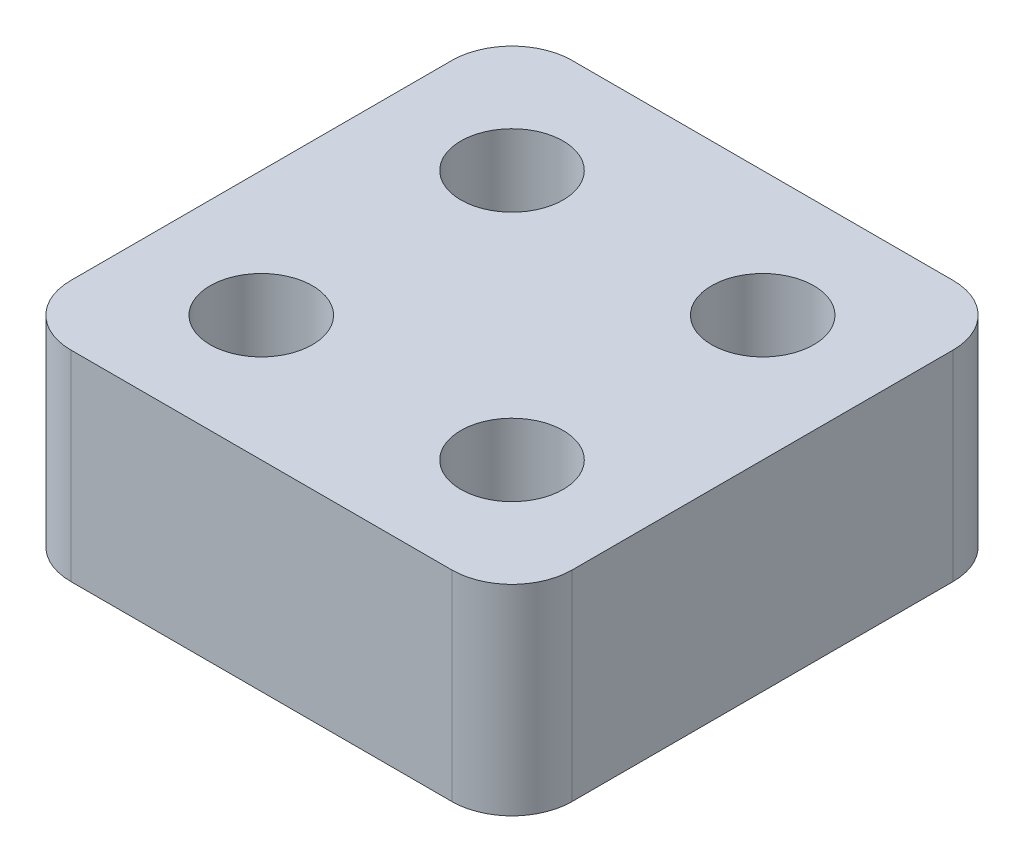
ISO-10303-21;
HEADER;
FILE_DESCRIPTION(('STEP AP214'),'2;1');
FILE_NAME('part.step','',(''),(''),'','','');
FILE_SCHEMA(('AUTOMOTIVE_DESIGN { 1 0 10303 214 1 1 1 1 }'));
ENDSEC;
DATA;
#1=APPLICATION_CONTEXT('core data for automotive mechanical design processes');
#2=APPLICATION_PROTOCOL_DEFINITION('international standard','automotive_design',2000,#1);
#3=PRODUCT_CONTEXT('',#1,'mechanical');
#4=PRODUCT('Part','Part','',(#3));
#5=PRODUCT_RELATED_PRODUCT_CATEGORY('part','',(#4));
#6=PRODUCT_DEFINITION_FORMATION('','',#4);
#7=PRODUCT_DEFINITION_CONTEXT('part definition',#1,'design');
#8=PRODUCT_DEFINITION('design','',#6,#7);
#9=PRODUCT_DEFINITION_SHAPE('','',#8);
#10=(LENGTH_UNIT() NAMED_UNIT(*) SI_UNIT(.MILLI.,.METRE.));
#11=(NAMED_UNIT(*) PLANE_ANGLE_UNIT() SI_UNIT($,.RADIAN.));
#12=(NAMED_UNIT(*) SI_UNIT($,.STERADIAN.) SOLID_ANGLE_UNIT());
#13=UNCERTAINTY_MEASURE_WITH_UNIT(LENGTH_MEASURE(1.E-05),#10,'distance_accuracy_value','');
#14=(GEOMETRIC_REPRESENTATION_CONTEXT(3) GLOBAL_UNCERTAINTY_ASSIGNED_CONTEXT((#13)) GLOBAL_UNIT_ASSIGNED_CONTEXT((#10,
#11,#12)) REPRESENTATION_CONTEXT('',''));
#15=CARTESIAN_POINT('',(0.,0.,0.));
#16=DIRECTION('',(0.,0.,1.));
#17=DIRECTION('',(1.,0.,0.));
#18=AXIS2_PLACEMENT_3D('',#15,#16,#17);
#19=CARTESIAN_POINT('',(-9.50000000000002,10.,9.49999999999997));
#20=DIRECTION('',(0.,1.,0.));
#21=DIRECTION('',(0.,0.,1.));
#22=AXIS2_PLACEMENT_3D('',#19,#20,#21);
#23=PLANE('',#22);
#24=CARTESIAN_POINT('',(-6.25000000000003,10.,6.25000000000005));
#25=DIRECTION('',(0.,1.,0.));
#26=DIRECTION('',(0.,0.,1.));
#27=AXIS2_PLACEMENT_3D('',#24,#25,#26);
#28=CIRCLE('',#27,2.55);
#29=CARTESIAN_POINT('',(-6.25000000000003,10.,8.80000000000005));
#30=VERTEX_POINT('',#29);
#31=EDGE_CURVE('E192',#30,#30,#28,.T.);
#32=ORIENTED_EDGE('',*,*,#31,.F.);
#33=EDGE_LOOP('',(#32));
#34=FACE_BOUND('',#33,.T.);
#35=CARTESIAN_POINT('',(-6.24999999999997,10.,-6.25000000000011));
#36=DIRECTION('',(0.,1.,0.));
#37=DIRECTION('',(0.,0.,1.));
#38=AXIS2_PLACEMENT_3D('',#35,#36,#37);
#39=CIRCLE('',#38,2.55);
#40=CARTESIAN_POINT('',(-6.24999999999997,10.,-3.70000000000011));
#41=VERTEX_POINT('',#40);
#42=EDGE_CURVE('E138',#41,#41,#39,.T.);
#43=ORIENTED_EDGE('',*,*,#42,.F.);
#44=EDGE_LOOP('',(#43));
#45=FACE_BOUND('',#44,.T.);
#46=CARTESIAN_POINT('',(-9.50000000000002,10.,9.49999999999997));
#47=DIRECTION('',(0.,1.,0.));
#48=DIRECTION('',(0.,0.,1.));
#49=AXIS2_PLACEMENT_3D('',#46,#47,#48);
#50=CIRCLE('',#49,3.);
#51=CARTESIAN_POINT('',(-12.5,10.,9.49999999999997));
#52=VERTEX_POINT('',#51);
#53=CARTESIAN_POINT('',(-9.50000000000002,10.,12.5));
#54=VERTEX_POINT('',#53);
#55=EDGE_CURVE('E149',#52,#54,#50,.T.);
#56=ORIENTED_EDGE('',*,*,#55,.T.);
#57=DIRECTION('',(1.,0.,0.));
#58=VECTOR('',#57,1.);
#59=CARTESIAN_POINT('',(-9.50000000000002,10.,12.5));
#60=LINE('',#59,#58);
#61=CARTESIAN_POINT('',(9.49999999999998,10.,12.5));
#62=VERTEX_POINT('',#61);
#63=EDGE_CURVE('E97',#54,#62,#60,.T.);
#64=ORIENTED_EDGE('',*,*,#63,.T.);
#65=CARTESIAN_POINT('',(9.49999999999998,10.,9.49999999999997));
#66=DIRECTION('',(0.,1.,0.));
#67=DIRECTION('',(0.,0.,1.));
#68=AXIS2_PLACEMENT_3D('',#65,#66,#67);
#69=CIRCLE('',#68,3.);
#70=CARTESIAN_POINT('',(12.5,10.,9.49999999999997));
#71=VERTEX_POINT('',#70);
#72=EDGE_CURVE('E164',#62,#71,#69,.T.);
#73=ORIENTED_EDGE('',*,*,#72,.T.);
#74=DIRECTION('',(0.,0.,-1.));
#75=VECTOR('',#74,1.);
#76=CARTESIAN_POINT('',(12.5,10.,-9.49999999999995));
#77=LINE('',#76,#75);
#78=CARTESIAN_POINT('',(12.5,10.,-9.49999999999995));
#79=VERTEX_POINT('',#78);
#80=EDGE_CURVE('E177',#71,#79,#77,.T.);
#81=ORIENTED_EDGE('',*,*,#80,.T.);
#82=CARTESIAN_POINT('',(9.49999999999998,10.,-9.49999999999995));
#83=DIRECTION('',(0.,1.,0.));
#84=DIRECTION('',(0.,0.,-1.));
#85=AXIS2_PLACEMENT_3D('',#82,#83,#84);
#86=CIRCLE('',#85,3.);
#87=CARTESIAN_POINT('',(9.49999999999998,10.,-12.4999999999999));
#88=VERTEX_POINT('',#87);
#89=EDGE_CURVE('E116',#79,#88,#86,.T.);
#90=ORIENTED_EDGE('',*,*,#89,.T.);
#91=DIRECTION('',(-1.,0.,0.));
#92=VECTOR('',#91,1.);
#93=CARTESIAN_POINT('',(-9.50000000000002,10.,-12.4999999999999));
#94=LINE('',#93,#92);
#95=CARTESIAN_POINT('',(-9.50000000000002,10.,-12.4999999999999));
#96=VERTEX_POINT('',#95);
#97=EDGE_CURVE('E110',#88,#96,#94,.T.);
#98=ORIENTED_EDGE('',*,*,#97,.T.);
#99=CARTESIAN_POINT('',(-9.50000000000002,10.,-9.49999999999995));
#100=DIRECTION('',(0.,1.,0.));
#101=DIRECTION('',(0.,0.,1.));
#102=AXIS2_PLACEMENT_3D('',#99,#100,#101);
#103=CIRCLE('',#102,3.);
#104=CARTESIAN_POINT('',(-12.5,10.,-9.49999999999995));
#105=VERTEX_POINT('',#104);
#106=EDGE_CURVE('E114',#96,#105,#103,.T.);
#107=ORIENTED_EDGE('',*,*,#106,.T.);
#108=DIRECTION('',(0.,0.,1.));
#109=VECTOR('',#108,1.);
#110=CARTESIAN_POINT('',(-12.5,10.,-9.49999999999995));
#111=LINE('',#110,#109);
#112=EDGE_CURVE('E54',#105,#52,#111,.T.);
#113=ORIENTED_EDGE('',*,*,#112,.T.);
#114=EDGE_LOOP('',(#56,#64,#73,#81,#90,#98,#107,#113));
#115=FACE_BOUND('',#114,.T.);
#116=CARTESIAN_POINT('',(6.25000000000004,10.,-6.25));
#117=DIRECTION('',(0.,1.,0.));
#118=DIRECTION('',(0.,0.,1.));
#119=AXIS2_PLACEMENT_3D('',#116,#117,#118);
#120=CIRCLE('',#119,2.55);
#121=CARTESIAN_POINT('',(6.25000000000004,10.,-3.69999999999999));
#122=VERTEX_POINT('',#121);
#123=EDGE_CURVE('E186',#122,#122,#120,.T.);
#124=ORIENTED_EDGE('',*,*,#123,.F.);
#125=EDGE_LOOP('',(#124));
#126=FACE_BOUND('',#125,.T.);
#127=CARTESIAN_POINT('',(6.25000000000007,10.,6.25000000000002));
#128=DIRECTION('',(0.,1.,0.));
#129=DIRECTION('',(0.,0.,1.));
#130=AXIS2_PLACEMENT_3D('',#127,#128,#129);
#131=CIRCLE('',#130,2.55);
#132=CARTESIAN_POINT('',(6.25000000000007,10.,8.80000000000002));
#133=VERTEX_POINT('',#132);
#134=EDGE_CURVE('E198',#133,#133,#131,.T.);
#135=ORIENTED_EDGE('',*,*,#134,.F.);
#136=EDGE_LOOP('',(#135));
#137=FACE_BOUND('',#136,.T.);
#138=ADVANCED_FACE('F37',(#34,#45,#115,#126,#137),#23,.T.);
#139=CARTESIAN_POINT('',(-9.50000000000002,0.,9.49999999999997));
#140=DIRECTION('',(0.,1.,0.));
#141=DIRECTION('',(0.,0.,1.));
#142=AXIS2_PLACEMENT_3D('',#139,#140,#141);
#143=PLANE('',#142);
#144=CARTESIAN_POINT('',(-9.50000000000002,0.,9.49999999999997));
#145=DIRECTION('',(0.,1.,0.));
#146=DIRECTION('',(0.,0.,1.));
#147=AXIS2_PLACEMENT_3D('',#144,#145,#146);
#148=CIRCLE('',#147,3.);
#149=CARTESIAN_POINT('',(-12.5,0.,9.49999999999997));
#150=VERTEX_POINT('',#149);
#151=CARTESIAN_POINT('',(-9.50000000000002,0.,12.5));
#152=VERTEX_POINT('',#151);
#153=EDGE_CURVE('E134',#150,#152,#148,.T.);
#154=ORIENTED_EDGE('',*,*,#153,.F.);
#155=DIRECTION('',(0.,0.,1.));
#156=VECTOR('',#155,1.);
#157=CARTESIAN_POINT('',(-12.5,0.,-9.49999999999995));
#158=LINE('',#157,#156);
#159=CARTESIAN_POINT('',(-12.5,0.,-9.49999999999995));
#160=VERTEX_POINT('',#159);
#161=EDGE_CURVE('E89',#160,#150,#158,.T.);
#162=ORIENTED_EDGE('',*,*,#161,.F.);
#163=CARTESIAN_POINT('',(-9.50000000000002,0.,-9.49999999999995));
#164=DIRECTION('',(0.,1.,0.));
#165=DIRECTION('',(0.,0.,1.));
#166=AXIS2_PLACEMENT_3D('',#163,#164,#165);
#167=CIRCLE('',#166,3.);
#168=CARTESIAN_POINT('',(-9.50000000000002,0.,-12.4999999999999));
#169=VERTEX_POINT('',#168);
#170=EDGE_CURVE('E83',#169,#160,#167,.T.);
#171=ORIENTED_EDGE('',*,*,#170,.F.);
#172=DIRECTION('',(-1.,0.,0.));
#173=VECTOR('',#172,1.);
#174=CARTESIAN_POINT('',(-9.50000000000002,0.,-12.4999999999999));
#175=LINE('',#174,#173);
#176=CARTESIAN_POINT('',(9.49999999999998,0.,-12.4999999999999));
#177=VERTEX_POINT('',#176);
#178=EDGE_CURVE('E124',#177,#169,#175,.T.);
#179=ORIENTED_EDGE('',*,*,#178,.F.);
#180=CARTESIAN_POINT('',(9.49999999999998,0.,-9.49999999999995));
#181=DIRECTION('',(0.,1.,0.));
#182=DIRECTION('',(0.,0.,-1.));
#183=AXIS2_PLACEMENT_3D('',#180,#181,#182);
#184=CIRCLE('',#183,3.);
#185=CARTESIAN_POINT('',(12.5,0.,-9.49999999999995));
#186=VERTEX_POINT('',#185);
#187=EDGE_CURVE('E144',#186,#177,#184,.T.);
#188=ORIENTED_EDGE('',*,*,#187,.F.);
#189=DIRECTION('',(0.,0.,-1.));
#190=VECTOR('',#189,1.);
#191=CARTESIAN_POINT('',(12.5,0.,-9.49999999999995));
#192=LINE('',#191,#190);
#193=CARTESIAN_POINT('',(12.5,0.,9.49999999999997));
#194=VERTEX_POINT('',#193);
#195=EDGE_CURVE('E142',#194,#186,#192,.T.);
#196=ORIENTED_EDGE('',*,*,#195,.F.);
#197=CARTESIAN_POINT('',(9.49999999999998,0.,9.49999999999997));
#198=DIRECTION('',(0.,1.,0.));
#199=DIRECTION('',(0.,0.,1.));
#200=AXIS2_PLACEMENT_3D('',#197,#198,#199);
#201=CIRCLE('',#200,3.);
#202=CARTESIAN_POINT('',(9.49999999999998,0.,12.5));
#203=VERTEX_POINT('',#202);
#204=EDGE_CURVE('E140',#203,#194,#201,.T.);
#205=ORIENTED_EDGE('',*,*,#204,.F.);
#206=DIRECTION('',(1.,0.,0.));
#207=VECTOR('',#206,1.);
#208=CARTESIAN_POINT('',(-9.50000000000002,0.,12.5));
#209=LINE('',#208,#207);
#210=EDGE_CURVE('E137',#152,#203,#209,.T.);
#211=ORIENTED_EDGE('',*,*,#210,.F.);
#212=EDGE_LOOP('',(#154,#162,#171,#179,#188,#196,#205,#211));
#213=FACE_BOUND('',#212,.T.);
#214=CARTESIAN_POINT('',(-6.24999999999997,0.,-6.25000000000011));
#215=DIRECTION('',(0.,1.,0.));
#216=DIRECTION('',(0.,0.,1.));
#217=AXIS2_PLACEMENT_3D('',#214,#215,#216);
#218=CIRCLE('',#217,2.55);
#219=CARTESIAN_POINT('',(-6.24999999999997,0.,-3.70000000000011));
#220=VERTEX_POINT('',#219);
#221=EDGE_CURVE('E183',#220,#220,#218,.T.);
#222=ORIENTED_EDGE('',*,*,#221,.T.);
#223=EDGE_LOOP('',(#222));
#224=FACE_BOUND('',#223,.T.);
#225=CARTESIAN_POINT('',(6.25000000000004,0.,-6.25));
#226=DIRECTION('',(0.,1.,0.));
#227=DIRECTION('',(0.,0.,1.));
#228=AXIS2_PLACEMENT_3D('',#225,#226,#227);
#229=CIRCLE('',#228,2.55);
#230=CARTESIAN_POINT('',(6.25000000000004,0.,-3.69999999999999));
#231=VERTEX_POINT('',#230);
#232=EDGE_CURVE('E189',#231,#231,#229,.T.);
#233=ORIENTED_EDGE('',*,*,#232,.T.);
#234=EDGE_LOOP('',(#233));
#235=FACE_BOUND('',#234,.T.);
#236=CARTESIAN_POINT('',(-6.25000000000003,0.,6.25000000000005));
#237=DIRECTION('',(0.,1.,0.));
#238=DIRECTION('',(0.,0.,1.));
#239=AXIS2_PLACEMENT_3D('',#236,#237,#238);
#240=CIRCLE('',#239,2.55);
#241=CARTESIAN_POINT('',(-6.25000000000003,0.,8.80000000000005));
#242=VERTEX_POINT('',#241);
#243=EDGE_CURVE('E195',#242,#242,#240,.T.);
#244=ORIENTED_EDGE('',*,*,#243,.T.);
#245=EDGE_LOOP('',(#244));
#246=FACE_BOUND('',#245,.T.);
#247=CARTESIAN_POINT('',(6.25000000000007,0.,6.25000000000002));
#248=DIRECTION('',(0.,1.,0.));
#249=DIRECTION('',(0.,0.,1.));
#250=AXIS2_PLACEMENT_3D('',#247,#248,#249);
#251=CIRCLE('',#250,2.55);
#252=CARTESIAN_POINT('',(6.25000000000007,0.,8.80000000000002));
#253=VERTEX_POINT('',#252);
#254=EDGE_CURVE('E201',#253,#253,#251,.T.);
#255=ORIENTED_EDGE('',*,*,#254,.T.);
#256=EDGE_LOOP('',(#255));
#257=FACE_BOUND('',#256,.T.);
#258=ADVANCED_FACE('F168',(#213,#224,#235,#246,#257),#143,.F.);
#259=CARTESIAN_POINT('',(-9.50000000000002,10.,9.49999999999997));
#260=DIRECTION('',(0.,-1.,0.));
#261=DIRECTION('',(0.,0.,-1.));
#262=AXIS2_PLACEMENT_3D('',#259,#260,#261);
#263=CYLINDRICAL_SURFACE('',#262,3.);
#264=ORIENTED_EDGE('',*,*,#153,.T.);
#265=DIRECTION('',(0.,-1.,0.));
#266=VECTOR('',#265,1.);
#267=CARTESIAN_POINT('',(-9.50000000000002,10.,12.5));
#268=LINE('',#267,#266);
#269=EDGE_CURVE('E11',#54,#152,#268,.T.);
#270=ORIENTED_EDGE('',*,*,#269,.F.);
#271=ORIENTED_EDGE('',*,*,#55,.F.);
#272=DIRECTION('',(0.,-1.,0.));
#273=VECTOR('',#272,1.);
#274=CARTESIAN_POINT('',(-12.5,10.,9.49999999999997));
#275=LINE('',#274,#273);
#276=EDGE_CURVE('E130',#52,#150,#275,.T.);
#277=ORIENTED_EDGE('',*,*,#276,.T.);
#278=EDGE_LOOP('',(#264,#270,#271,#277));
#279=FACE_BOUND('',#278,.T.);
#280=ADVANCED_FACE('F39',(#279),#263,.T.);
#281=CARTESIAN_POINT('',(-9.50000000000002,10.,12.5));
#282=DIRECTION('',(0.,0.,-1.));
#283=DIRECTION('',(-1.,0.,0.));
#284=AXIS2_PLACEMENT_3D('',#281,#282,#283);
#285=PLANE('',#284);
#286=ORIENTED_EDGE('',*,*,#210,.T.);
#287=DIRECTION('',(0.,-1.,0.));
#288=VECTOR('',#287,1.);
#289=CARTESIAN_POINT('',(9.49999999999998,10.,12.5));
#290=LINE('',#289,#288);
#291=EDGE_CURVE('E46',#62,#203,#290,.T.);
#292=ORIENTED_EDGE('',*,*,#291,.F.);
#293=ORIENTED_EDGE('',*,*,#63,.F.);
#294=ORIENTED_EDGE('',*,*,#269,.T.);
#295=EDGE_LOOP('',(#286,#292,#293,#294));
#296=FACE_BOUND('',#295,.T.);
#297=ADVANCED_FACE('F235',(#296),#285,.F.);
#298=CARTESIAN_POINT('',(9.49999999999998,10.,9.49999999999997));
#299=DIRECTION('',(0.,-1.,0.));
#300=DIRECTION('',(0.,0.,-1.));
#301=AXIS2_PLACEMENT_3D('',#298,#299,#300);
#302=CYLINDRICAL_SURFACE('',#301,3.);
#303=ORIENTED_EDGE('',*,*,#204,.T.);
#304=DIRECTION('',(0.,-1.,0.));
#305=VECTOR('',#304,1.);
#306=CARTESIAN_POINT('',(12.5,10.,9.49999999999997));
#307=LINE('',#306,#305);
#308=EDGE_CURVE('E156',#71,#194,#307,.T.);
#309=ORIENTED_EDGE('',*,*,#308,.F.);
#310=ORIENTED_EDGE('',*,*,#72,.F.);
#311=ORIENTED_EDGE('',*,*,#291,.T.);
#312=EDGE_LOOP('',(#303,#309,#310,#311));
#313=FACE_BOUND('',#312,.T.);
#314=ADVANCED_FACE('F162',(#313),#302,.T.);
#315=CARTESIAN_POINT('',(12.5,10.,-9.49999999999995));
#316=DIRECTION('',(-1.,0.,0.));
#317=DIRECTION('',(0.,0.,1.));
#318=AXIS2_PLACEMENT_3D('',#315,#316,#317);
#319=PLANE('',#318);
#320=ORIENTED_EDGE('',*,*,#195,.T.);
#321=DIRECTION('',(0.,-1.,0.));
#322=VECTOR('',#321,1.);
#323=CARTESIAN_POINT('',(12.5,10.,-9.49999999999995));
#324=LINE('',#323,#322);
#325=EDGE_CURVE('E153',#79,#186,#324,.T.);
#326=ORIENTED_EDGE('',*,*,#325,.F.);
#327=ORIENTED_EDGE('',*,*,#80,.F.);
#328=ORIENTED_EDGE('',*,*,#308,.T.);
#329=EDGE_LOOP('',(#320,#326,#327,#328));
#330=FACE_BOUND('',#329,.T.);
#331=ADVANCED_FACE('F173',(#330),#319,.F.);
#332=CARTESIAN_POINT('',(9.49999999999998,10.,-9.49999999999995));
#333=DIRECTION('',(0.,-1.,0.));
#334=DIRECTION('',(0.,0.,-1.));
#335=AXIS2_PLACEMENT_3D('',#332,#333,#334);
#336=CYLINDRICAL_SURFACE('',#335,3.);
#337=ORIENTED_EDGE('',*,*,#187,.T.);
#338=DIRECTION('',(0.,-1.,0.));
#339=VECTOR('',#338,1.);
#340=CARTESIAN_POINT('',(9.49999999999998,10.,-12.4999999999999));
#341=LINE('',#340,#339);
#342=EDGE_CURVE('E125',#88,#177,#341,.T.);
#343=ORIENTED_EDGE('',*,*,#342,.F.);
#344=ORIENTED_EDGE('',*,*,#89,.F.);
#345=ORIENTED_EDGE('',*,*,#325,.T.);
#346=EDGE_LOOP('',(#337,#343,#344,#345));
#347=FACE_BOUND('',#346,.T.);
#348=ADVANCED_FACE('F176',(#347),#336,.T.);
#349=CARTESIAN_POINT('',(-9.50000000000002,10.,-12.4999999999999));
#350=DIRECTION('',(0.,0.,1.));
#351=DIRECTION('',(1.,0.,0.));
#352=AXIS2_PLACEMENT_3D('',#349,#350,#351);
#353=PLANE('',#352);
#354=ORIENTED_EDGE('',*,*,#178,.T.);
#355=DIRECTION('',(0.,-1.,0.));
#356=VECTOR('',#355,1.);
#357=CARTESIAN_POINT('',(-9.50000000000002,10.,-12.4999999999999));
#358=LINE('',#357,#356);
#359=EDGE_CURVE('E121',#96,#169,#358,.T.);
#360=ORIENTED_EDGE('',*,*,#359,.F.);
#361=ORIENTED_EDGE('',*,*,#97,.F.);
#362=ORIENTED_EDGE('',*,*,#342,.T.);
#363=EDGE_LOOP('',(#354,#360,#361,#362));
#364=FACE_BOUND('',#363,.T.);
#365=ADVANCED_FACE('F122',(#364),#353,.F.);
#366=CARTESIAN_POINT('',(-9.50000000000002,10.,-9.49999999999995));
#367=DIRECTION('',(0.,-1.,0.));
#368=DIRECTION('',(0.,0.,-1.));
#369=AXIS2_PLACEMENT_3D('',#366,#367,#368);
#370=CYLINDRICAL_SURFACE('',#369,3.);
#371=ORIENTED_EDGE('',*,*,#170,.T.);
#372=DIRECTION('',(0.,-1.,0.));
#373=VECTOR('',#372,1.);
#374=CARTESIAN_POINT('',(-12.5,10.,-9.49999999999995));
#375=LINE('',#374,#373);
#376=EDGE_CURVE('E126',#105,#160,#375,.T.);
#377=ORIENTED_EDGE('',*,*,#376,.F.);
#378=ORIENTED_EDGE('',*,*,#106,.F.);
#379=ORIENTED_EDGE('',*,*,#359,.T.);
#380=EDGE_LOOP('',(#371,#377,#378,#379));
#381=FACE_BOUND('',#380,.T.);
#382=ADVANCED_FACE('F128',(#381),#370,.T.);
#383=CARTESIAN_POINT('',(-12.5,10.,-9.49999999999995));
#384=DIRECTION('',(1.,0.,0.));
#385=DIRECTION('',(0.,0.,-1.));
#386=AXIS2_PLACEMENT_3D('',#383,#384,#385);
#387=PLANE('',#386);
#388=ORIENTED_EDGE('',*,*,#161,.T.);
#389=ORIENTED_EDGE('',*,*,#276,.F.);
#390=ORIENTED_EDGE('',*,*,#112,.F.);
#391=ORIENTED_EDGE('',*,*,#376,.T.);
#392=EDGE_LOOP('',(#388,#389,#390,#391));
#393=FACE_BOUND('',#392,.T.);
#394=ADVANCED_FACE('F223',(#393),#387,.F.);
#395=CARTESIAN_POINT('',(-6.24999999999997,10.,-6.25000000000011));
#396=DIRECTION('',(0.,-1.,0.));
#397=DIRECTION('',(0.,0.,-1.));
#398=AXIS2_PLACEMENT_3D('',#395,#396,#397);
#399=CYLINDRICAL_SURFACE('',#398,2.55);
#400=ORIENTED_EDGE('',*,*,#42,.T.);
#401=EDGE_LOOP('',(#400));
#402=FACE_BOUND('',#401,.T.);
#403=ORIENTED_EDGE('',*,*,#221,.F.);
#404=EDGE_LOOP('',(#403));
#405=FACE_BOUND('',#404,.T.);
#406=ADVANCED_FACE('F220',(#402,#405),#399,.F.);
#407=CARTESIAN_POINT('',(6.25000000000004,10.,-6.25));
#408=DIRECTION('',(0.,-1.,0.));
#409=DIRECTION('',(0.,0.,-1.));
#410=AXIS2_PLACEMENT_3D('',#407,#408,#409);
#411=CYLINDRICAL_SURFACE('',#410,2.55);
#412=ORIENTED_EDGE('',*,*,#123,.T.);
#413=EDGE_LOOP('',(#412));
#414=FACE_BOUND('',#413,.T.);
#415=ORIENTED_EDGE('',*,*,#232,.F.);
#416=EDGE_LOOP('',(#415));
#417=FACE_BOUND('',#416,.T.);
#418=ADVANCED_FACE('F299',(#414,#417),#411,.F.);
#419=CARTESIAN_POINT('',(-6.25000000000003,10.,6.25000000000005));
#420=DIRECTION('',(0.,-1.,0.));
#421=DIRECTION('',(0.,0.,-1.));
#422=AXIS2_PLACEMENT_3D('',#419,#420,#421);
#423=CYLINDRICAL_SURFACE('',#422,2.55);
#424=ORIENTED_EDGE('',*,*,#31,.T.);
#425=EDGE_LOOP('',(#424));
#426=FACE_BOUND('',#425,.T.);
#427=ORIENTED_EDGE('',*,*,#243,.F.);
#428=EDGE_LOOP('',(#427));
#429=FACE_BOUND('',#428,.T.);
#430=ADVANCED_FACE('F307',(#426,#429),#423,.F.);
#431=CARTESIAN_POINT('',(6.25000000000007,10.,6.25000000000002));
#432=DIRECTION('',(0.,-1.,0.));
#433=DIRECTION('',(0.,0.,-1.));
#434=AXIS2_PLACEMENT_3D('',#431,#432,#433);
#435=CYLINDRICAL_SURFACE('',#434,2.55);
#436=ORIENTED_EDGE('',*,*,#134,.T.);
#437=EDGE_LOOP('',(#436));
#438=FACE_BOUND('',#437,.T.);
#439=ORIENTED_EDGE('',*,*,#254,.F.);
#440=EDGE_LOOP('',(#439));
#441=FACE_BOUND('',#440,.T.);
#442=ADVANCED_FACE('F207',(#438,#441),#435,.F.);
#443=CLOSED_SHELL('',(#138,#258,#280,#297,#314,#331,#348,#365,#382,#394,#406,#418,#430,#442));
#444=MANIFOLD_SOLID_BREP('B2',#443);
#445=ADVANCED_BREP_SHAPE_REPRESENTATION('',(#18,#444),#14);
#446=SHAPE_DEFINITION_REPRESENTATION(#9,#445);
ENDSEC;
END-ISO-10303-21;
